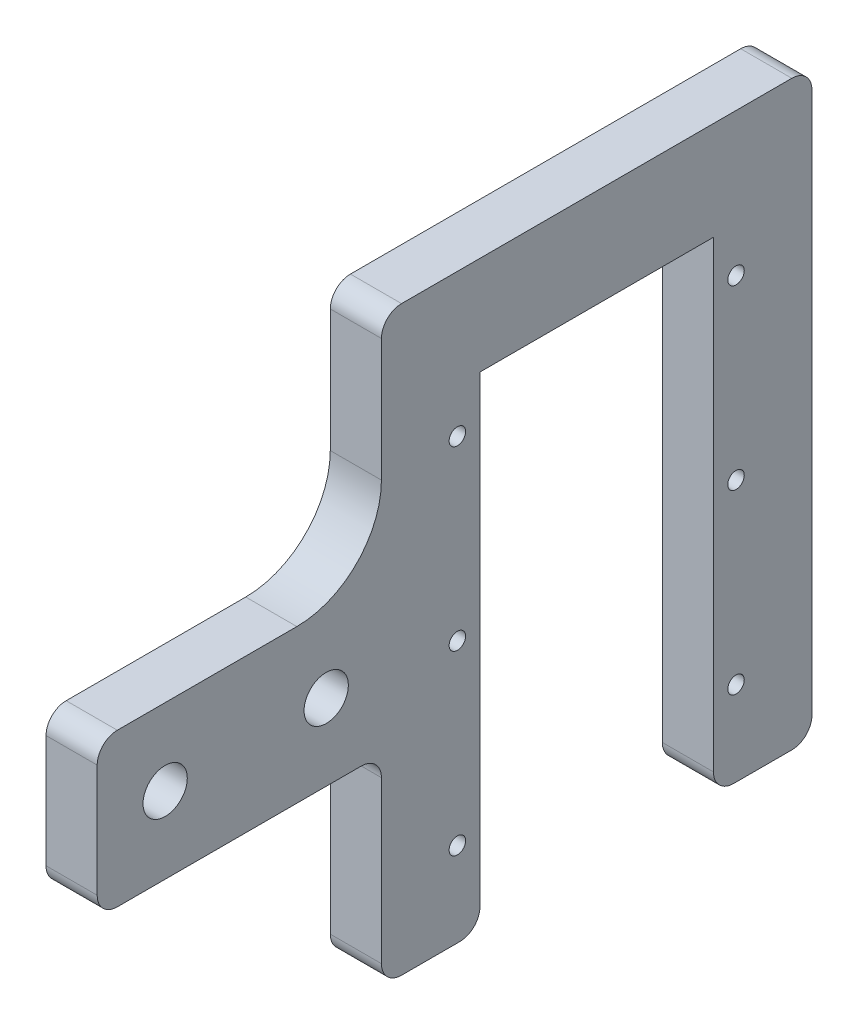
ISO-10303-21;
HEADER;
FILE_DESCRIPTION(('STEP AP214'),'2;1');
FILE_NAME('part.step','',(''),(''),'','','');
FILE_SCHEMA(('AUTOMOTIVE_DESIGN { 1 0 10303 214 1 1 1 1 }'));
ENDSEC;
DATA;
#1=APPLICATION_CONTEXT('core data for automotive mechanical design processes');
#2=APPLICATION_PROTOCOL_DEFINITION('international standard','automotive_design',2000,#1);
#3=PRODUCT_CONTEXT('',#1,'mechanical');
#4=PRODUCT('Part','Part','',(#3));
#5=PRODUCT_RELATED_PRODUCT_CATEGORY('part','',(#4));
#6=PRODUCT_DEFINITION_FORMATION('','',#4);
#7=PRODUCT_DEFINITION_CONTEXT('part definition',#1,'design');
#8=PRODUCT_DEFINITION('design','',#6,#7);
#9=PRODUCT_DEFINITION_SHAPE('','',#8);
#10=(LENGTH_UNIT() NAMED_UNIT(*) SI_UNIT(.MILLI.,.METRE.));
#11=(NAMED_UNIT(*) PLANE_ANGLE_UNIT() SI_UNIT($,.RADIAN.));
#12=(NAMED_UNIT(*) SI_UNIT($,.STERADIAN.) SOLID_ANGLE_UNIT());
#13=UNCERTAINTY_MEASURE_WITH_UNIT(LENGTH_MEASURE(1.E-05),#10,'distance_accuracy_value','');
#14=(GEOMETRIC_REPRESENTATION_CONTEXT(3) GLOBAL_UNCERTAINTY_ASSIGNED_CONTEXT((#13)) GLOBAL_UNIT_ASSIGNED_CONTEXT((#10,
#11,#12)) REPRESENTATION_CONTEXT('',''));
#15=CARTESIAN_POINT('',(0.,0.,0.));
#16=DIRECTION('',(0.,0.,1.));
#17=DIRECTION('',(1.,0.,0.));
#18=AXIS2_PLACEMENT_3D('',#15,#16,#17);
#19=CARTESIAN_POINT('',(3.175,-25.0000000000001,62.0272498174298));
#20=DIRECTION('',(0.,1.,0.));
#21=DIRECTION('',(0.,0.,1.));
#22=AXIS2_PLACEMENT_3D('',#19,#20,#21);
#23=PLANE('',#22);
#24=DIRECTION('',(0.,0.,-1.));
#25=VECTOR('',#24,1.);
#26=CARTESIAN_POINT('',(-3.175,-25.0000000000001,62.0272498174298));
#27=LINE('',#26,#25);
#28=CARTESIAN_POINT('',(-3.175,-25.0000000000001,59.5272498174298));
#29=VERTEX_POINT('',#28);
#30=CARTESIAN_POINT('',(-3.175,-25.,29.2316212801132));
#31=VERTEX_POINT('',#30);
#32=EDGE_CURVE('E206',#29,#31,#27,.T.);
#33=ORIENTED_EDGE('',*,*,#32,.T.);
#34=DIRECTION('',(-1.,0.,0.));
#35=VECTOR('',#34,1.);
#36=CARTESIAN_POINT('',(3.175,-25.,29.2316212801132));
#37=LINE('',#36,#35);
#38=CARTESIAN_POINT('',(3.175,-25.,29.2316212801132));
#39=VERTEX_POINT('',#38);
#40=EDGE_CURVE('E287',#31,#39,#37,.F.);
#41=ORIENTED_EDGE('',*,*,#40,.T.);
#42=DIRECTION('',(0.,0.,-1.));
#43=VECTOR('',#42,1.);
#44=CARTESIAN_POINT('',(3.175,-25.0000000000001,62.0272498174298));
#45=LINE('',#44,#43);
#46=CARTESIAN_POINT('',(3.175,-25.0000000000001,59.5272498174298));
#47=VERTEX_POINT('',#46);
#48=EDGE_CURVE('E215',#47,#39,#45,.T.);
#49=ORIENTED_EDGE('',*,*,#48,.F.);
#50=DIRECTION('',(-1.,0.,0.));
#51=VECTOR('',#50,1.);
#52=CARTESIAN_POINT('',(3.175,-25.0000000000001,59.5272498174298));
#53=LINE('',#52,#51);
#54=EDGE_CURVE('E284',#47,#29,#53,.T.);
#55=ORIENTED_EDGE('',*,*,#54,.T.);
#56=EDGE_LOOP('',(#33,#41,#49,#55));
#57=FACE_BOUND('',#56,.T.);
#58=ADVANCED_FACE('F33',(#57),#23,.F.);
#59=CARTESIAN_POINT('',(3.175,-6.00000000000009,62.0272498174298));
#60=DIRECTION('',(0.,-1.,0.));
#61=DIRECTION('',(0.,0.,-1.));
#62=AXIS2_PLACEMENT_3D('',#59,#60,#61);
#63=PLANE('',#62);
#64=DIRECTION('',(0.,0.,1.));
#65=VECTOR('',#64,1.);
#66=CARTESIAN_POINT('',(3.175,-6.00000000000009,62.0272498174298));
#67=LINE('',#66,#65);
#68=CARTESIAN_POINT('',(3.175,-6.00000000000009,37.2316212801132));
#69=VERTEX_POINT('',#68);
#70=CARTESIAN_POINT('',(3.175,-6.00000000000009,59.5272498174298));
#71=VERTEX_POINT('',#70);
#72=EDGE_CURVE('E218',#69,#71,#67,.T.);
#73=ORIENTED_EDGE('',*,*,#72,.F.);
#74=DIRECTION('',(1.,0.,0.));
#75=VECTOR('',#74,1.);
#76=CARTESIAN_POINT('',(-3.175,-6.00000000000009,37.2316212801132));
#77=LINE('',#76,#75);
#78=CARTESIAN_POINT('',(-3.175,-6.00000000000009,37.2316212801132));
#79=VERTEX_POINT('',#78);
#80=EDGE_CURVE('E54',#69,#79,#77,.F.);
#81=ORIENTED_EDGE('',*,*,#80,.T.);
#82=DIRECTION('',(0.,0.,1.));
#83=VECTOR('',#82,1.);
#84=CARTESIAN_POINT('',(-3.175,-6.00000000000009,62.0272498174298));
#85=LINE('',#84,#83);
#86=CARTESIAN_POINT('',(-3.175,-6.00000000000009,59.5272498174298));
#87=VERTEX_POINT('',#86);
#88=EDGE_CURVE('E210',#79,#87,#85,.T.);
#89=ORIENTED_EDGE('',*,*,#88,.T.);
#90=DIRECTION('',(-1.,0.,0.));
#91=VECTOR('',#90,1.);
#92=CARTESIAN_POINT('',(3.175,-6.00000000000009,59.5272498174298));
#93=LINE('',#92,#91);
#94=EDGE_CURVE('E294',#87,#71,#93,.F.);
#95=ORIENTED_EDGE('',*,*,#94,.T.);
#96=EDGE_LOOP('',(#73,#81,#89,#95));
#97=FACE_BOUND('',#96,.T.);
#98=ADVANCED_FACE('F460',(#97),#63,.F.);
#99=CARTESIAN_POINT('',(3.175,-25.0000000000001,62.0272498174298));
#100=DIRECTION('',(0.,0.,-1.));
#101=DIRECTION('',(0.,1.,0.));
#102=AXIS2_PLACEMENT_3D('',#99,#100,#101);
#103=PLANE('',#102);
#104=DIRECTION('',(0.,-1.,0.));
#105=VECTOR('',#104,1.);
#106=CARTESIAN_POINT('',(-3.175,-25.0000000000001,62.0272498174298));
#107=LINE('',#106,#105);
#108=CARTESIAN_POINT('',(-3.175,-8.50000000000009,62.0272498174298));
#109=VERTEX_POINT('',#108);
#110=CARTESIAN_POINT('',(-3.175,-22.5000000000001,62.0272498174298));
#111=VERTEX_POINT('',#110);
#112=EDGE_CURVE('E219',#109,#111,#107,.T.);
#113=ORIENTED_EDGE('',*,*,#112,.T.);
#114=DIRECTION('',(-1.,0.,0.));
#115=VECTOR('',#114,1.);
#116=CARTESIAN_POINT('',(3.175,-22.5000000000001,62.0272498174298));
#117=LINE('',#116,#115);
#118=CARTESIAN_POINT('',(3.175,-22.5000000000001,62.0272498174298));
#119=VERTEX_POINT('',#118);
#120=EDGE_CURVE('E292',#111,#119,#117,.F.);
#121=ORIENTED_EDGE('',*,*,#120,.T.);
#122=DIRECTION('',(0.,-1.,0.));
#123=VECTOR('',#122,1.);
#124=CARTESIAN_POINT('',(3.175,-25.0000000000001,62.0272498174298));
#125=LINE('',#124,#123);
#126=CARTESIAN_POINT('',(3.175,-8.50000000000009,62.0272498174298));
#127=VERTEX_POINT('',#126);
#128=EDGE_CURVE('E221',#127,#119,#125,.T.);
#129=ORIENTED_EDGE('',*,*,#128,.F.);
#130=DIRECTION('',(-1.,0.,0.));
#131=VECTOR('',#130,1.);
#132=CARTESIAN_POINT('',(3.175,-8.50000000000009,62.0272498174298));
#133=LINE('',#132,#131);
#134=EDGE_CURVE('E289',#127,#109,#133,.T.);
#135=ORIENTED_EDGE('',*,*,#134,.T.);
#136=EDGE_LOOP('',(#113,#121,#129,#135));
#137=FACE_BOUND('',#136,.T.);
#138=ADVANCED_FACE('F425',(#137),#103,.F.);
#139=CARTESIAN_POINT('',(3.175,0.,0.));
#140=DIRECTION('',(1.,0.,0.));
#141=DIRECTION('',(0.,0.,-1.));
#142=AXIS2_PLACEMENT_3D('',#139,#140,#141);
#143=PLANE('',#142);
#144=CARTESIAN_POINT('',(3.175,-15.5000000000001,53.5872498174298));
#145=DIRECTION('',(1.,0.,0.));
#146=DIRECTION('',(0.,0.,-1.));
#147=AXIS2_PLACEMENT_3D('',#144,#145,#146);
#148=CIRCLE('',#147,2.75);
#149=CARTESIAN_POINT('',(3.175,-15.5000000000001,50.8372498174298));
#150=VERTEX_POINT('',#149);
#151=EDGE_CURVE('E417',#150,#150,#148,.T.);
#152=ORIENTED_EDGE('',*,*,#151,.F.);
#153=EDGE_LOOP('',(#152));
#154=FACE_BOUND('',#153,.T.);
#155=CARTESIAN_POINT('',(3.175,-15.5000000000001,33.5872498174298));
#156=DIRECTION('',(1.,0.,0.));
#157=DIRECTION('',(0.,0.,-1.));
#158=AXIS2_PLACEMENT_3D('',#155,#156,#157);
#159=CIRCLE('',#158,2.75);
#160=CARTESIAN_POINT('',(3.175,-15.5000000000001,30.8372498174298));
#161=VERTEX_POINT('',#160);
#162=EDGE_CURVE('E411',#161,#161,#159,.T.);
#163=ORIENTED_EDGE('',*,*,#162,.F.);
#164=EDGE_LOOP('',(#163));
#165=FACE_BOUND('',#164,.T.);
#166=CARTESIAN_POINT('',(3.175,4.49999999999998,-17.3));
#167=DIRECTION('',(1.,0.,0.));
#168=DIRECTION('',(0.,0.,-1.));
#169=AXIS2_PLACEMENT_3D('',#166,#167,#168);
#170=CIRCLE('',#169,1.02499999999994);
#171=CARTESIAN_POINT('',(3.175,4.49999999999998,-18.3249999999999));
#172=VERTEX_POINT('',#171);
#173=EDGE_CURVE('E403',#172,#172,#170,.T.);
#174=ORIENTED_EDGE('',*,*,#173,.F.);
#175=EDGE_LOOP('',(#174));
#176=FACE_BOUND('',#175,.T.);
#177=CARTESIAN_POINT('',(3.175,-17.5,-17.3));
#178=DIRECTION('',(1.,0.,0.));
#179=DIRECTION('',(0.,0.,-1.));
#180=AXIS2_PLACEMENT_3D('',#177,#178,#179);
#181=CIRCLE('',#180,1.02499999999994);
#182=CARTESIAN_POINT('',(3.175,-17.5,-18.3249999999999));
#183=VERTEX_POINT('',#182);
#184=EDGE_CURVE('E397',#183,#183,#181,.T.);
#185=ORIENTED_EDGE('',*,*,#184,.F.);
#186=EDGE_LOOP('',(#185));
#187=FACE_BOUND('',#186,.T.);
#188=CARTESIAN_POINT('',(3.175,-39.5,-17.3));
#189=DIRECTION('',(1.,0.,0.));
#190=DIRECTION('',(0.,0.,-1.));
#191=AXIS2_PLACEMENT_3D('',#188,#189,#190);
#192=CIRCLE('',#191,1.02499999999994);
#193=CARTESIAN_POINT('',(3.175,-39.5,-18.3249999999999));
#194=VERTEX_POINT('',#193);
#195=EDGE_CURVE('E391',#194,#194,#192,.T.);
#196=ORIENTED_EDGE('',*,*,#195,.F.);
#197=EDGE_LOOP('',(#196));
#198=FACE_BOUND('',#197,.T.);
#199=CARTESIAN_POINT('',(3.175,4.49999999999998,17.3));
#200=DIRECTION('',(-1.,0.,0.));
#201=DIRECTION('',(0.,0.,1.));
#202=AXIS2_PLACEMENT_3D('',#199,#200,#201);
#203=CIRCLE('',#202,1.02499999999995);
#204=CARTESIAN_POINT('',(3.175,4.49999999999998,18.325));
#205=VERTEX_POINT('',#204);
#206=EDGE_CURVE('E385',#205,#205,#203,.T.);
#207=ORIENTED_EDGE('',*,*,#206,.T.);
#208=EDGE_LOOP('',(#207));
#209=FACE_BOUND('',#208,.T.);
#210=CARTESIAN_POINT('',(3.175,-17.5,17.3));
#211=DIRECTION('',(-1.,0.,0.));
#212=DIRECTION('',(0.,0.,1.));
#213=AXIS2_PLACEMENT_3D('',#210,#211,#212);
#214=CIRCLE('',#213,1.02499999999995);
#215=CARTESIAN_POINT('',(3.175,-17.5,18.325));
#216=VERTEX_POINT('',#215);
#217=EDGE_CURVE('E379',#216,#216,#214,.T.);
#218=ORIENTED_EDGE('',*,*,#217,.T.);
#219=EDGE_LOOP('',(#218));
#220=FACE_BOUND('',#219,.T.);
#221=CARTESIAN_POINT('',(3.175,-39.5,17.3));
#222=DIRECTION('',(-1.,0.,0.));
#223=DIRECTION('',(0.,0.,1.));
#224=AXIS2_PLACEMENT_3D('',#221,#222,#223);
#225=CIRCLE('',#224,1.02499999999995);
#226=CARTESIAN_POINT('',(3.175,-39.5,18.325));
#227=VERTEX_POINT('',#226);
#228=EDGE_CURVE('E338',#227,#227,#225,.T.);
#229=ORIENTED_EDGE('',*,*,#228,.T.);
#230=EDGE_LOOP('',(#229));
#231=FACE_BOUND('',#230,.T.);
#232=DIRECTION('',(0.,0.,-1.));
#233=VECTOR('',#232,1.);
#234=CARTESIAN_POINT('',(3.175,-50.,-14.5));
#235=LINE('',#234,#233);
#236=CARTESIAN_POINT('',(3.175,-50.,-17.));
#237=VERTEX_POINT('',#236);
#238=CARTESIAN_POINT('',(3.175,-50.,-24.2316212801132));
#239=VERTEX_POINT('',#238);
#240=EDGE_CURVE('E190',#237,#239,#235,.T.);
#241=ORIENTED_EDGE('',*,*,#240,.T.);
#242=CARTESIAN_POINT('',(3.175,-47.5,-24.2316212801132));
#243=DIRECTION('',(1.,0.,0.));
#244=DIRECTION('',(0.,0.,-1.));
#245=AXIS2_PLACEMENT_3D('',#242,#243,#244);
#246=CIRCLE('',#245,2.5);
#247=CARTESIAN_POINT('',(3.175,-47.5,-26.7316212801132));
#248=VERTEX_POINT('',#247);
#249=EDGE_CURVE('E268',#239,#248,#246,.T.);
#250=ORIENTED_EDGE('',*,*,#249,.T.);
#251=DIRECTION('',(0.,1.,0.));
#252=VECTOR('',#251,1.);
#253=CARTESIAN_POINT('',(3.175,-50.,-26.7316212801132));
#254=LINE('',#253,#252);
#255=CARTESIAN_POINT('',(3.175,19.7316212801132,-26.7316212801132));
#256=VERTEX_POINT('',#255);
#257=EDGE_CURVE('E369',#248,#256,#254,.T.);
#258=ORIENTED_EDGE('',*,*,#257,.T.);
#259=CARTESIAN_POINT('',(3.175,19.7316212801132,-24.2316212801132));
#260=DIRECTION('',(1.,0.,0.));
#261=DIRECTION('',(0.,0.,-1.));
#262=AXIS2_PLACEMENT_3D('',#259,#260,#261);
#263=CIRCLE('',#262,2.5);
#264=CARTESIAN_POINT('',(3.175,22.2316212801132,-24.2316212801132));
#265=VERTEX_POINT('',#264);
#266=EDGE_CURVE('E256',#256,#265,#263,.T.);
#267=ORIENTED_EDGE('',*,*,#266,.T.);
#268=DIRECTION('',(0.,0.,1.));
#269=VECTOR('',#268,1.);
#270=CARTESIAN_POINT('',(3.175,22.2316212801132,-26.7316212801132));
#271=LINE('',#270,#269);
#272=CARTESIAN_POINT('',(3.175,22.2316212801132,24.2316212801132));
#273=VERTEX_POINT('',#272);
#274=EDGE_CURVE('E331',#265,#273,#271,.T.);
#275=ORIENTED_EDGE('',*,*,#274,.T.);
#276=CARTESIAN_POINT('',(3.175,19.7316212801132,24.2316212801132));
#277=DIRECTION('',(1.,0.,0.));
#278=DIRECTION('',(0.,0.,-1.));
#279=AXIS2_PLACEMENT_3D('',#276,#277,#278);
#280=CIRCLE('',#279,2.5);
#281=CARTESIAN_POINT('',(3.175,19.7316212801132,26.7316212801132));
#282=VERTEX_POINT('',#281);
#283=EDGE_CURVE('E254',#273,#282,#280,.T.);
#284=ORIENTED_EDGE('',*,*,#283,.T.);
#285=DIRECTION('',(0.,-1.,0.));
#286=VECTOR('',#285,1.);
#287=CARTESIAN_POINT('',(3.175,22.2316212801132,26.7316212801132));
#288=LINE('',#287,#286);
#289=CARTESIAN_POINT('',(3.175,4.49999999999991,26.7316212801132));
#290=VERTEX_POINT('',#289);
#291=EDGE_CURVE('E317',#282,#290,#288,.T.);
#292=ORIENTED_EDGE('',*,*,#291,.T.);
#293=CARTESIAN_POINT('',(3.175,4.49999999999991,37.2316212801132));
#294=DIRECTION('',(1.,0.,0.));
#295=DIRECTION('',(0.,0.,-1.));
#296=AXIS2_PLACEMENT_3D('',#293,#294,#295);
#297=CIRCLE('',#296,10.5);
#298=EDGE_CURVE('E41',#290,#69,#297,.F.);
#299=ORIENTED_EDGE('',*,*,#298,.T.);
#300=ORIENTED_EDGE('',*,*,#72,.T.);
#301=CARTESIAN_POINT('',(3.175,-8.50000000000009,59.5272498174298));
#302=DIRECTION('',(1.,0.,0.));
#303=DIRECTION('',(0.,0.,-1.));
#304=AXIS2_PLACEMENT_3D('',#301,#302,#303);
#305=CIRCLE('',#304,2.5);
#306=EDGE_CURVE('E258',#71,#127,#305,.T.);
#307=ORIENTED_EDGE('',*,*,#306,.T.);
#308=ORIENTED_EDGE('',*,*,#128,.T.);
#309=CARTESIAN_POINT('',(3.175,-22.5000000000001,59.5272498174298));
#310=DIRECTION('',(1.,0.,0.));
#311=DIRECTION('',(0.,0.,-1.));
#312=AXIS2_PLACEMENT_3D('',#309,#310,#311);
#313=CIRCLE('',#312,2.5);
#314=EDGE_CURVE('E260',#119,#47,#313,.T.);
#315=ORIENTED_EDGE('',*,*,#314,.T.);
#316=ORIENTED_EDGE('',*,*,#48,.T.);
#317=CARTESIAN_POINT('',(3.175,-27.5,29.2316212801132));
#318=DIRECTION('',(1.,0.,0.));
#319=DIRECTION('',(0.,0.,-1.));
#320=AXIS2_PLACEMENT_3D('',#317,#318,#319);
#321=CIRCLE('',#320,2.5);
#322=CARTESIAN_POINT('',(3.175,-27.5,26.7316212801132));
#323=VERTEX_POINT('',#322);
#324=EDGE_CURVE('E307',#39,#323,#321,.F.);
#325=ORIENTED_EDGE('',*,*,#324,.T.);
#326=CARTESIAN_POINT('',(3.175,-47.5,26.7316212801132));
#327=VERTEX_POINT('',#326);
#328=EDGE_CURVE('E326',#323,#327,#288,.T.);
#329=ORIENTED_EDGE('',*,*,#328,.T.);
#330=CARTESIAN_POINT('',(3.175,-47.5,24.2316212801132));
#331=DIRECTION('',(1.,0.,0.));
#332=DIRECTION('',(0.,0.,-1.));
#333=AXIS2_PLACEMENT_3D('',#330,#331,#332);
#334=CIRCLE('',#333,2.5);
#335=CARTESIAN_POINT('',(3.175,-50.,24.2316212801132));
#336=VERTEX_POINT('',#335);
#337=EDGE_CURVE('E262',#327,#336,#334,.T.);
#338=ORIENTED_EDGE('',*,*,#337,.T.);
#339=DIRECTION('',(0.,0.,-1.));
#340=VECTOR('',#339,1.);
#341=CARTESIAN_POINT('',(3.175,-50.,26.7316212801132));
#342=LINE('',#341,#340);
#343=CARTESIAN_POINT('',(3.175,-50.,17.));
#344=VERTEX_POINT('',#343);
#345=EDGE_CURVE('E325',#336,#344,#342,.T.);
#346=ORIENTED_EDGE('',*,*,#345,.T.);
#347=CARTESIAN_POINT('',(3.175,-47.5,17.));
#348=DIRECTION('',(1.,0.,0.));
#349=DIRECTION('',(0.,0.,-1.));
#350=AXIS2_PLACEMENT_3D('',#347,#348,#349);
#351=CIRCLE('',#350,2.5);
#352=CARTESIAN_POINT('',(3.175,-47.5,14.5));
#353=VERTEX_POINT('',#352);
#354=EDGE_CURVE('E264',#344,#353,#351,.T.);
#355=ORIENTED_EDGE('',*,*,#354,.T.);
#356=DIRECTION('',(0.,1.,0.));
#357=VECTOR('',#356,1.);
#358=CARTESIAN_POINT('',(3.175,-50.,14.5));
#359=LINE('',#358,#357);
#360=CARTESIAN_POINT('',(3.175,10.,14.5));
#361=VERTEX_POINT('',#360);
#362=EDGE_CURVE('E197',#353,#361,#359,.T.);
#363=ORIENTED_EDGE('',*,*,#362,.T.);
#364=DIRECTION('',(0.,0.,-1.));
#365=VECTOR('',#364,1.);
#366=CARTESIAN_POINT('',(3.175,10.,14.5));
#367=LINE('',#366,#365);
#368=CARTESIAN_POINT('',(3.175,10.,-14.5));
#369=VERTEX_POINT('',#368);
#370=EDGE_CURVE('E191',#361,#369,#367,.T.);
#371=ORIENTED_EDGE('',*,*,#370,.T.);
#372=DIRECTION('',(0.,-1.,0.));
#373=VECTOR('',#372,1.);
#374=CARTESIAN_POINT('',(3.175,10.,-14.5));
#375=LINE('',#374,#373);
#376=CARTESIAN_POINT('',(3.175,-47.5,-14.5));
#377=VERTEX_POINT('',#376);
#378=EDGE_CURVE('E180',#369,#377,#375,.T.);
#379=ORIENTED_EDGE('',*,*,#378,.T.);
#380=CARTESIAN_POINT('',(3.175,-47.5,-17.));
#381=DIRECTION('',(1.,0.,0.));
#382=DIRECTION('',(0.,0.,-1.));
#383=AXIS2_PLACEMENT_3D('',#380,#381,#382);
#384=CIRCLE('',#383,2.5);
#385=EDGE_CURVE('E266',#377,#237,#384,.T.);
#386=ORIENTED_EDGE('',*,*,#385,.T.);
#387=EDGE_LOOP('',(#241,#250,#258,#267,#275,#284,#292,#299,#300,#307,#308,#315,#316,#325,#329,
#338,#346,#355,#363,#371,#379,#386));
#388=FACE_BOUND('',#387,.T.);
#389=ADVANCED_FACE('F195',(#154,#165,#176,#187,#198,#209,#220,#231,#388),#143,.T.);
#390=CARTESIAN_POINT('',(-3.175,0.,0.));
#391=DIRECTION('',(1.,0.,0.));
#392=DIRECTION('',(0.,0.,-1.));
#393=AXIS2_PLACEMENT_3D('',#390,#391,#392);
#394=PLANE('',#393);
#395=CARTESIAN_POINT('',(-3.175,-15.5000000000001,53.5872498174298));
#396=DIRECTION('',(1.,0.,0.));
#397=DIRECTION('',(0.,0.,-1.));
#398=AXIS2_PLACEMENT_3D('',#395,#396,#397);
#399=CIRCLE('',#398,2.75);
#400=CARTESIAN_POINT('',(-3.175,-15.5000000000001,50.8372498174298));
#401=VERTEX_POINT('',#400);
#402=EDGE_CURVE('E414',#401,#401,#399,.T.);
#403=ORIENTED_EDGE('',*,*,#402,.T.);
#404=EDGE_LOOP('',(#403));
#405=FACE_BOUND('',#404,.T.);
#406=CARTESIAN_POINT('',(-3.175,-15.5000000000001,33.5872498174298));
#407=DIRECTION('',(1.,0.,0.));
#408=DIRECTION('',(0.,0.,-1.));
#409=AXIS2_PLACEMENT_3D('',#406,#407,#408);
#410=CIRCLE('',#409,2.75);
#411=CARTESIAN_POINT('',(-3.175,-15.5000000000001,30.8372498174298));
#412=VERTEX_POINT('',#411);
#413=EDGE_CURVE('E406',#412,#412,#410,.T.);
#414=ORIENTED_EDGE('',*,*,#413,.T.);
#415=EDGE_LOOP('',(#414));
#416=FACE_BOUND('',#415,.T.);
#417=CARTESIAN_POINT('',(-3.175,4.49999999999998,-17.3));
#418=DIRECTION('',(1.,0.,0.));
#419=DIRECTION('',(0.,0.,-1.));
#420=AXIS2_PLACEMENT_3D('',#417,#418,#419);
#421=CIRCLE('',#420,1.02499999999994);
#422=CARTESIAN_POINT('',(-3.175,4.49999999999998,-18.3249999999999));
#423=VERTEX_POINT('',#422);
#424=EDGE_CURVE('E400',#423,#423,#421,.T.);
#425=ORIENTED_EDGE('',*,*,#424,.T.);
#426=EDGE_LOOP('',(#425));
#427=FACE_BOUND('',#426,.T.);
#428=CARTESIAN_POINT('',(-3.175,-17.5,-17.3));
#429=DIRECTION('',(1.,0.,0.));
#430=DIRECTION('',(0.,0.,-1.));
#431=AXIS2_PLACEMENT_3D('',#428,#429,#430);
#432=CIRCLE('',#431,1.02499999999994);
#433=CARTESIAN_POINT('',(-3.175,-17.5,-18.3249999999999));
#434=VERTEX_POINT('',#433);
#435=EDGE_CURVE('E394',#434,#434,#432,.T.);
#436=ORIENTED_EDGE('',*,*,#435,.T.);
#437=EDGE_LOOP('',(#436));
#438=FACE_BOUND('',#437,.T.);
#439=CARTESIAN_POINT('',(-3.175,-39.5,-17.3));
#440=DIRECTION('',(1.,0.,0.));
#441=DIRECTION('',(0.,0.,-1.));
#442=AXIS2_PLACEMENT_3D('',#439,#440,#441);
#443=CIRCLE('',#442,1.02499999999994);
#444=CARTESIAN_POINT('',(-3.175,-39.5,-18.3249999999999));
#445=VERTEX_POINT('',#444);
#446=EDGE_CURVE('E388',#445,#445,#443,.T.);
#447=ORIENTED_EDGE('',*,*,#446,.T.);
#448=EDGE_LOOP('',(#447));
#449=FACE_BOUND('',#448,.T.);
#450=CARTESIAN_POINT('',(-3.175,4.49999999999998,17.3));
#451=DIRECTION('',(-1.,0.,0.));
#452=DIRECTION('',(0.,0.,1.));
#453=AXIS2_PLACEMENT_3D('',#450,#451,#452);
#454=CIRCLE('',#453,1.02499999999995);
#455=CARTESIAN_POINT('',(-3.175,4.49999999999998,18.325));
#456=VERTEX_POINT('',#455);
#457=EDGE_CURVE('E382',#456,#456,#454,.T.);
#458=ORIENTED_EDGE('',*,*,#457,.F.);
#459=EDGE_LOOP('',(#458));
#460=FACE_BOUND('',#459,.T.);
#461=CARTESIAN_POINT('',(-3.175,-17.5,17.3));
#462=DIRECTION('',(-1.,0.,0.));
#463=DIRECTION('',(0.,0.,1.));
#464=AXIS2_PLACEMENT_3D('',#461,#462,#463);
#465=CIRCLE('',#464,1.02499999999995);
#466=CARTESIAN_POINT('',(-3.175,-17.5,18.325));
#467=VERTEX_POINT('',#466);
#468=EDGE_CURVE('E376',#467,#467,#465,.T.);
#469=ORIENTED_EDGE('',*,*,#468,.F.);
#470=EDGE_LOOP('',(#469));
#471=FACE_BOUND('',#470,.T.);
#472=CARTESIAN_POINT('',(-3.175,-39.5,17.3));
#473=DIRECTION('',(-1.,0.,0.));
#474=DIRECTION('',(0.,0.,1.));
#475=AXIS2_PLACEMENT_3D('',#472,#473,#474);
#476=CIRCLE('',#475,1.02499999999995);
#477=CARTESIAN_POINT('',(-3.175,-39.5,18.325));
#478=VERTEX_POINT('',#477);
#479=EDGE_CURVE('E373',#478,#478,#476,.T.);
#480=ORIENTED_EDGE('',*,*,#479,.F.);
#481=EDGE_LOOP('',(#480));
#482=FACE_BOUND('',#481,.T.);
#483=DIRECTION('',(0.,1.,0.));
#484=VECTOR('',#483,1.);
#485=CARTESIAN_POINT('',(-3.175,-50.,-26.7316212801132));
#486=LINE('',#485,#484);
#487=CARTESIAN_POINT('',(-3.175,-47.5,-26.7316212801132));
#488=VERTEX_POINT('',#487);
#489=CARTESIAN_POINT('',(-3.175,19.7316212801132,-26.7316212801132));
#490=VERTEX_POINT('',#489);
#491=EDGE_CURVE('E343',#488,#490,#486,.T.);
#492=ORIENTED_EDGE('',*,*,#491,.F.);
#493=CARTESIAN_POINT('',(-3.175,-47.5,-24.2316212801132));
#494=DIRECTION('',(1.,0.,0.));
#495=DIRECTION('',(0.,0.,-1.));
#496=AXIS2_PLACEMENT_3D('',#493,#494,#495);
#497=CIRCLE('',#496,2.5);
#498=CARTESIAN_POINT('',(-3.175,-50.,-24.2316212801132));
#499=VERTEX_POINT('',#498);
#500=EDGE_CURVE('E247',#488,#499,#497,.F.);
#501=ORIENTED_EDGE('',*,*,#500,.T.);
#502=DIRECTION('',(0.,0.,-1.));
#503=VECTOR('',#502,1.);
#504=CARTESIAN_POINT('',(-3.175,-50.,-14.5));
#505=LINE('',#504,#503);
#506=CARTESIAN_POINT('',(-3.175,-50.,-17.));
#507=VERTEX_POINT('',#506);
#508=EDGE_CURVE('E340',#507,#499,#505,.T.);
#509=ORIENTED_EDGE('',*,*,#508,.F.);
#510=CARTESIAN_POINT('',(-3.175,-47.5,-17.));
#511=DIRECTION('',(1.,0.,0.));
#512=DIRECTION('',(0.,0.,-1.));
#513=AXIS2_PLACEMENT_3D('',#510,#511,#512);
#514=CIRCLE('',#513,2.5);
#515=CARTESIAN_POINT('',(-3.175,-47.5,-14.5));
#516=VERTEX_POINT('',#515);
#517=EDGE_CURVE('E245',#507,#516,#514,.F.);
#518=ORIENTED_EDGE('',*,*,#517,.T.);
#519=DIRECTION('',(0.,-1.,0.));
#520=VECTOR('',#519,1.);
#521=CARTESIAN_POINT('',(-3.175,10.,-14.5));
#522=LINE('',#521,#520);
#523=CARTESIAN_POINT('',(-3.175,10.,-14.5));
#524=VERTEX_POINT('',#523);
#525=EDGE_CURVE('E337',#524,#516,#522,.T.);
#526=ORIENTED_EDGE('',*,*,#525,.F.);
#527=DIRECTION('',(0.,0.,-1.));
#528=VECTOR('',#527,1.);
#529=CARTESIAN_POINT('',(-3.175,10.,14.5));
#530=LINE('',#529,#528);
#531=CARTESIAN_POINT('',(-3.175,10.,14.5));
#532=VERTEX_POINT('',#531);
#533=EDGE_CURVE('E205',#532,#524,#530,.T.);
#534=ORIENTED_EDGE('',*,*,#533,.F.);
#535=DIRECTION('',(0.,1.,0.));
#536=VECTOR('',#535,1.);
#537=CARTESIAN_POINT('',(-3.175,-50.,14.5));
#538=LINE('',#537,#536);
#539=CARTESIAN_POINT('',(-3.175,-47.5,14.5));
#540=VERTEX_POINT('',#539);
#541=EDGE_CURVE('E201',#540,#532,#538,.T.);
#542=ORIENTED_EDGE('',*,*,#541,.F.);
#543=CARTESIAN_POINT('',(-3.175,-47.5,17.));
#544=DIRECTION('',(1.,0.,0.));
#545=DIRECTION('',(0.,0.,-1.));
#546=AXIS2_PLACEMENT_3D('',#543,#544,#545);
#547=CIRCLE('',#546,2.5);
#548=CARTESIAN_POINT('',(-3.175,-50.,17.));
#549=VERTEX_POINT('',#548);
#550=EDGE_CURVE('E243',#540,#549,#547,.F.);
#551=ORIENTED_EDGE('',*,*,#550,.T.);
#552=DIRECTION('',(0.,0.,-1.));
#553=VECTOR('',#552,1.);
#554=CARTESIAN_POINT('',(-3.175,-50.,26.7316212801132));
#555=LINE('',#554,#553);
#556=CARTESIAN_POINT('',(-3.175,-50.,24.2316212801132));
#557=VERTEX_POINT('',#556);
#558=EDGE_CURVE('E351',#557,#549,#555,.T.);
#559=ORIENTED_EDGE('',*,*,#558,.F.);
#560=CARTESIAN_POINT('',(-3.175,-47.5,24.2316212801132));
#561=DIRECTION('',(1.,0.,0.));
#562=DIRECTION('',(0.,0.,-1.));
#563=AXIS2_PLACEMENT_3D('',#560,#561,#562);
#564=CIRCLE('',#563,2.5);
#565=CARTESIAN_POINT('',(-3.175,-47.5,26.7316212801132));
#566=VERTEX_POINT('',#565);
#567=EDGE_CURVE('E241',#557,#566,#564,.F.);
#568=ORIENTED_EDGE('',*,*,#567,.T.);
#569=DIRECTION('',(0.,-1.,0.));
#570=VECTOR('',#569,1.);
#571=CARTESIAN_POINT('',(-3.175,22.2316212801132,26.7316212801132));
#572=LINE('',#571,#570);
#573=CARTESIAN_POINT('',(-3.175,-27.5,26.7316212801132));
#574=VERTEX_POINT('',#573);
#575=EDGE_CURVE('E349',#574,#566,#572,.T.);
#576=ORIENTED_EDGE('',*,*,#575,.F.);
#577=CARTESIAN_POINT('',(-3.175,-27.5,29.2316212801132));
#578=DIRECTION('',(1.,0.,0.));
#579=DIRECTION('',(0.,0.,-1.));
#580=AXIS2_PLACEMENT_3D('',#577,#578,#579);
#581=CIRCLE('',#580,2.5);
#582=EDGE_CURVE('E305',#574,#31,#581,.T.);
#583=ORIENTED_EDGE('',*,*,#582,.T.);
#584=ORIENTED_EDGE('',*,*,#32,.F.);
#585=CARTESIAN_POINT('',(-3.175,-22.5000000000001,59.5272498174298));
#586=DIRECTION('',(1.,0.,0.));
#587=DIRECTION('',(0.,0.,-1.));
#588=AXIS2_PLACEMENT_3D('',#585,#586,#587);
#589=CIRCLE('',#588,2.5);
#590=EDGE_CURVE('E239',#29,#111,#589,.F.);
#591=ORIENTED_EDGE('',*,*,#590,.T.);
#592=ORIENTED_EDGE('',*,*,#112,.F.);
#593=CARTESIAN_POINT('',(-3.175,-8.50000000000009,59.5272498174298));
#594=DIRECTION('',(1.,0.,0.));
#595=DIRECTION('',(0.,0.,-1.));
#596=AXIS2_PLACEMENT_3D('',#593,#594,#595);
#597=CIRCLE('',#596,2.5);
#598=EDGE_CURVE('E236',#109,#87,#597,.F.);
#599=ORIENTED_EDGE('',*,*,#598,.T.);
#600=ORIENTED_EDGE('',*,*,#88,.F.);
#601=CARTESIAN_POINT('',(-3.175,4.49999999999991,37.2316212801132));
#602=DIRECTION('',(1.,0.,0.));
#603=DIRECTION('',(0.,0.,-1.));
#604=AXIS2_PLACEMENT_3D('',#601,#602,#603);
#605=CIRCLE('',#604,10.5);
#606=CARTESIAN_POINT('',(-3.175,4.49999999999991,26.7316212801132));
#607=VERTEX_POINT('',#606);
#608=EDGE_CURVE('E11',#79,#607,#605,.T.);
#609=ORIENTED_EDGE('',*,*,#608,.T.);
#610=CARTESIAN_POINT('',(-3.175,19.7316212801132,26.7316212801132));
#611=VERTEX_POINT('',#610);
#612=EDGE_CURVE('E320',#611,#607,#572,.T.);
#613=ORIENTED_EDGE('',*,*,#612,.F.);
#614=CARTESIAN_POINT('',(-3.175,19.7316212801132,24.2316212801132));
#615=DIRECTION('',(1.,0.,0.));
#616=DIRECTION('',(0.,0.,-1.));
#617=AXIS2_PLACEMENT_3D('',#614,#615,#616);
#618=CIRCLE('',#617,2.5);
#619=CARTESIAN_POINT('',(-3.175,22.2316212801132,24.2316212801132));
#620=VERTEX_POINT('',#619);
#621=EDGE_CURVE('E232',#611,#620,#618,.F.);
#622=ORIENTED_EDGE('',*,*,#621,.T.);
#623=DIRECTION('',(0.,0.,1.));
#624=VECTOR('',#623,1.);
#625=CARTESIAN_POINT('',(-3.175,22.2316212801132,-26.7316212801132));
#626=LINE('',#625,#624);
#627=CARTESIAN_POINT('',(-3.175,22.2316212801132,-24.2316212801132));
#628=VERTEX_POINT('',#627);
#629=EDGE_CURVE('E346',#628,#620,#626,.T.);
#630=ORIENTED_EDGE('',*,*,#629,.F.);
#631=CARTESIAN_POINT('',(-3.175,19.7316212801132,-24.2316212801132));
#632=DIRECTION('',(1.,0.,0.));
#633=DIRECTION('',(0.,0.,-1.));
#634=AXIS2_PLACEMENT_3D('',#631,#632,#633);
#635=CIRCLE('',#634,2.5);
#636=EDGE_CURVE('E234',#628,#490,#635,.F.);
#637=ORIENTED_EDGE('',*,*,#636,.T.);
#638=EDGE_LOOP('',(#492,#501,#509,#518,#526,#534,#542,#551,#559,#568,#576,#583,#584,#591,#592,
#599,#600,#609,#613,#622,#630,#637));
#639=FACE_BOUND('',#638,.T.);
#640=ADVANCED_FACE('F359',(#405,#416,#427,#438,#449,#460,#471,#482,#639),#394,.F.);
#641=CARTESIAN_POINT('',(3.175,22.2316212801132,26.7316212801132));
#642=DIRECTION('',(0.,0.,-1.));
#643=DIRECTION('',(0.,1.,0.));
#644=AXIS2_PLACEMENT_3D('',#641,#642,#643);
#645=PLANE('',#644);
#646=ORIENTED_EDGE('',*,*,#575,.T.);
#647=DIRECTION('',(-1.,0.,0.));
#648=VECTOR('',#647,1.);
#649=CARTESIAN_POINT('',(3.175,-47.5,26.7316212801132));
#650=LINE('',#649,#648);
#651=EDGE_CURVE('E282',#566,#327,#650,.F.);
#652=ORIENTED_EDGE('',*,*,#651,.T.);
#653=ORIENTED_EDGE('',*,*,#328,.F.);
#654=DIRECTION('',(-1.,0.,0.));
#655=VECTOR('',#654,1.);
#656=CARTESIAN_POINT('',(-3.175,-27.5,26.7316212801132));
#657=LINE('',#656,#655);
#658=EDGE_CURVE('E279',#323,#574,#657,.T.);
#659=ORIENTED_EDGE('',*,*,#658,.T.);
#660=EDGE_LOOP('',(#646,#652,#653,#659));
#661=FACE_BOUND('',#660,.T.);
#662=ADVANCED_FACE('F449',(#661),#645,.F.);
#663=ORIENTED_EDGE('',*,*,#612,.T.);
#664=DIRECTION('',(1.,0.,0.));
#665=VECTOR('',#664,1.);
#666=CARTESIAN_POINT('',(3.175,4.49999999999991,26.7316212801132));
#667=LINE('',#666,#665);
#668=EDGE_CURVE('E309',#607,#290,#667,.T.);
#669=ORIENTED_EDGE('',*,*,#668,.T.);
#670=ORIENTED_EDGE('',*,*,#291,.F.);
#671=DIRECTION('',(-1.,0.,0.));
#672=VECTOR('',#671,1.);
#673=CARTESIAN_POINT('',(3.175,19.7316212801132,26.7316212801132));
#674=LINE('',#673,#672);
#675=EDGE_CURVE('E302',#282,#611,#674,.T.);
#676=ORIENTED_EDGE('',*,*,#675,.T.);
#677=EDGE_LOOP('',(#663,#669,#670,#676));
#678=FACE_BOUND('',#677,.T.);
#679=ADVANCED_FACE('F316',(#678),#645,.F.);
#680=CARTESIAN_POINT('',(3.175,10.,14.5));
#681=DIRECTION('',(0.,1.,0.));
#682=DIRECTION('',(0.,0.,1.));
#683=AXIS2_PLACEMENT_3D('',#680,#681,#682);
#684=PLANE('',#683);
#685=ORIENTED_EDGE('',*,*,#533,.T.);
#686=DIRECTION('',(-1.,0.,0.));
#687=VECTOR('',#686,1.);
#688=CARTESIAN_POINT('',(3.175,10.,-14.5));
#689=LINE('',#688,#687);
#690=EDGE_CURVE('E185',#369,#524,#689,.T.);
#691=ORIENTED_EDGE('',*,*,#690,.F.);
#692=ORIENTED_EDGE('',*,*,#370,.F.);
#693=DIRECTION('',(-1.,0.,0.));
#694=VECTOR('',#693,1.);
#695=CARTESIAN_POINT('',(3.175,10.,14.5));
#696=LINE('',#695,#694);
#697=EDGE_CURVE('E207',#361,#532,#696,.T.);
#698=ORIENTED_EDGE('',*,*,#697,.T.);
#699=EDGE_LOOP('',(#685,#691,#692,#698));
#700=FACE_BOUND('',#699,.T.);
#701=ADVANCED_FACE('F203',(#700),#684,.F.);
#702=CARTESIAN_POINT('',(3.175,10.,-14.5));
#703=DIRECTION('',(0.,0.,-1.));
#704=DIRECTION('',(0.,1.,0.));
#705=AXIS2_PLACEMENT_3D('',#702,#703,#704);
#706=PLANE('',#705);
#707=ORIENTED_EDGE('',*,*,#525,.T.);
#708=DIRECTION('',(-1.,0.,0.));
#709=VECTOR('',#708,1.);
#710=CARTESIAN_POINT('',(3.175,-47.5,-14.5));
#711=LINE('',#710,#709);
#712=EDGE_CURVE('E188',#516,#377,#711,.F.);
#713=ORIENTED_EDGE('',*,*,#712,.T.);
#714=ORIENTED_EDGE('',*,*,#378,.F.);
#715=ORIENTED_EDGE('',*,*,#690,.T.);
#716=EDGE_LOOP('',(#707,#713,#714,#715));
#717=FACE_BOUND('',#716,.T.);
#718=ADVANCED_FACE('F183',(#717),#706,.F.);
#719=CARTESIAN_POINT('',(3.175,-50.,-14.5));
#720=DIRECTION('',(0.,1.,0.));
#721=DIRECTION('',(0.,0.,1.));
#722=AXIS2_PLACEMENT_3D('',#719,#720,#721);
#723=PLANE('',#722);
#724=ORIENTED_EDGE('',*,*,#508,.T.);
#725=DIRECTION('',(-1.,0.,0.));
#726=VECTOR('',#725,1.);
#727=CARTESIAN_POINT('',(3.175,-50.,-24.2316212801132));
#728=LINE('',#727,#726);
#729=EDGE_CURVE('E252',#499,#239,#728,.F.);
#730=ORIENTED_EDGE('',*,*,#729,.T.);
#731=ORIENTED_EDGE('',*,*,#240,.F.);
#732=DIRECTION('',(-1.,0.,0.));
#733=VECTOR('',#732,1.);
#734=CARTESIAN_POINT('',(3.175,-50.,-17.));
#735=LINE('',#734,#733);
#736=EDGE_CURVE('E249',#237,#507,#735,.T.);
#737=ORIENTED_EDGE('',*,*,#736,.T.);
#738=EDGE_LOOP('',(#724,#730,#731,#737));
#739=FACE_BOUND('',#738,.T.);
#740=ADVANCED_FACE('F367',(#739),#723,.F.);
#741=CARTESIAN_POINT('',(3.175,-50.,-26.7316212801132));
#742=DIRECTION('',(0.,0.,1.));
#743=DIRECTION('',(1.,0.,0.));
#744=AXIS2_PLACEMENT_3D('',#741,#742,#743);
#745=PLANE('',#744);
#746=ORIENTED_EDGE('',*,*,#257,.F.);
#747=DIRECTION('',(-1.,0.,0.));
#748=VECTOR('',#747,1.);
#749=CARTESIAN_POINT('',(3.175,-47.5,-26.7316212801132));
#750=LINE('',#749,#748);
#751=EDGE_CURVE('E229',#248,#488,#750,.T.);
#752=ORIENTED_EDGE('',*,*,#751,.T.);
#753=ORIENTED_EDGE('',*,*,#491,.T.);
#754=DIRECTION('',(-1.,0.,0.));
#755=VECTOR('',#754,1.);
#756=CARTESIAN_POINT('',(3.175,19.7316212801132,-26.7316212801132));
#757=LINE('',#756,#755);
#758=EDGE_CURVE('E223',#490,#256,#757,.F.);
#759=ORIENTED_EDGE('',*,*,#758,.T.);
#760=EDGE_LOOP('',(#746,#752,#753,#759));
#761=FACE_BOUND('',#760,.T.);
#762=ADVANCED_FACE('F539',(#761),#745,.F.);
#763=CARTESIAN_POINT('',(3.175,22.2316212801132,-26.7316212801132));
#764=DIRECTION('',(0.,-1.,0.));
#765=DIRECTION('',(0.,0.,-1.));
#766=AXIS2_PLACEMENT_3D('',#763,#764,#765);
#767=PLANE('',#766);
#768=ORIENTED_EDGE('',*,*,#274,.F.);
#769=DIRECTION('',(-1.,0.,0.));
#770=VECTOR('',#769,1.);
#771=CARTESIAN_POINT('',(3.175,22.2316212801132,-24.2316212801132));
#772=LINE('',#771,#770);
#773=EDGE_CURVE('E299',#265,#628,#772,.T.);
#774=ORIENTED_EDGE('',*,*,#773,.T.);
#775=ORIENTED_EDGE('',*,*,#629,.T.);
#776=DIRECTION('',(-1.,0.,0.));
#777=VECTOR('',#776,1.);
#778=CARTESIAN_POINT('',(3.175,22.2316212801132,24.2316212801132));
#779=LINE('',#778,#777);
#780=EDGE_CURVE('E297',#620,#273,#779,.F.);
#781=ORIENTED_EDGE('',*,*,#780,.T.);
#782=EDGE_LOOP('',(#768,#774,#775,#781));
#783=FACE_BOUND('',#782,.T.);
#784=ADVANCED_FACE('F532',(#783),#767,.F.);
#785=CARTESIAN_POINT('',(3.175,-50.,26.7316212801132));
#786=DIRECTION('',(0.,1.,0.));
#787=DIRECTION('',(0.,0.,1.));
#788=AXIS2_PLACEMENT_3D('',#785,#786,#787);
#789=PLANE('',#788);
#790=ORIENTED_EDGE('',*,*,#558,.T.);
#791=DIRECTION('',(-1.,0.,0.));
#792=VECTOR('',#791,1.);
#793=CARTESIAN_POINT('',(3.175,-50.,17.));
#794=LINE('',#793,#792);
#795=EDGE_CURVE('E277',#549,#344,#794,.F.);
#796=ORIENTED_EDGE('',*,*,#795,.T.);
#797=ORIENTED_EDGE('',*,*,#345,.F.);
#798=DIRECTION('',(-1.,0.,0.));
#799=VECTOR('',#798,1.);
#800=CARTESIAN_POINT('',(3.175,-50.,24.2316212801132));
#801=LINE('',#800,#799);
#802=EDGE_CURVE('E274',#336,#557,#801,.T.);
#803=ORIENTED_EDGE('',*,*,#802,.T.);
#804=EDGE_LOOP('',(#790,#796,#797,#803));
#805=FACE_BOUND('',#804,.T.);
#806=ADVANCED_FACE('F528',(#805),#789,.F.);
#807=CARTESIAN_POINT('',(3.175,-50.,14.5));
#808=DIRECTION('',(0.,0.,1.));
#809=DIRECTION('',(1.,0.,0.));
#810=AXIS2_PLACEMENT_3D('',#807,#808,#809);
#811=PLANE('',#810);
#812=ORIENTED_EDGE('',*,*,#362,.F.);
#813=DIRECTION('',(-1.,0.,0.));
#814=VECTOR('',#813,1.);
#815=CARTESIAN_POINT('',(3.175,-47.5,14.5));
#816=LINE('',#815,#814);
#817=EDGE_CURVE('E271',#353,#540,#816,.T.);
#818=ORIENTED_EDGE('',*,*,#817,.T.);
#819=ORIENTED_EDGE('',*,*,#541,.T.);
#820=ORIENTED_EDGE('',*,*,#697,.F.);
#821=EDGE_LOOP('',(#812,#818,#819,#820));
#822=FACE_BOUND('',#821,.T.);
#823=ADVANCED_FACE('F355',(#822),#811,.F.);
#824=CARTESIAN_POINT('',(3.175,-39.5,17.3));
#825=DIRECTION('',(-1.,0.,0.));
#826=DIRECTION('',(0.,0.,1.));
#827=AXIS2_PLACEMENT_3D('',#824,#825,#826);
#828=CYLINDRICAL_SURFACE('',#827,1.02499999999995);
#829=ORIENTED_EDGE('',*,*,#228,.F.);
#830=EDGE_LOOP('',(#829));
#831=FACE_BOUND('',#830,.T.);
#832=ORIENTED_EDGE('',*,*,#479,.T.);
#833=EDGE_LOOP('',(#832));
#834=FACE_BOUND('',#833,.T.);
#835=ADVANCED_FACE('F441',(#831,#834),#828,.F.);
#836=CARTESIAN_POINT('',(3.175,-17.5,17.3));
#837=DIRECTION('',(-1.,0.,0.));
#838=DIRECTION('',(0.,0.,1.));
#839=AXIS2_PLACEMENT_3D('',#836,#837,#838);
#840=CYLINDRICAL_SURFACE('',#839,1.02499999999995);
#841=ORIENTED_EDGE('',*,*,#217,.F.);
#842=EDGE_LOOP('',(#841));
#843=FACE_BOUND('',#842,.T.);
#844=ORIENTED_EDGE('',*,*,#468,.T.);
#845=EDGE_LOOP('',(#844));
#846=FACE_BOUND('',#845,.T.);
#847=ADVANCED_FACE('F444',(#843,#846),#840,.F.);
#848=CARTESIAN_POINT('',(3.175,4.49999999999998,17.3));
#849=DIRECTION('',(-1.,0.,0.));
#850=DIRECTION('',(0.,0.,1.));
#851=AXIS2_PLACEMENT_3D('',#848,#849,#850);
#852=CYLINDRICAL_SURFACE('',#851,1.02499999999995);
#853=ORIENTED_EDGE('',*,*,#206,.F.);
#854=EDGE_LOOP('',(#853));
#855=FACE_BOUND('',#854,.T.);
#856=ORIENTED_EDGE('',*,*,#457,.T.);
#857=EDGE_LOOP('',(#856));
#858=FACE_BOUND('',#857,.T.);
#859=ADVANCED_FACE('F732',(#855,#858),#852,.F.);
#860=CARTESIAN_POINT('',(3.175,-39.5,-17.3));
#861=DIRECTION('',(-1.,0.,0.));
#862=DIRECTION('',(0.,0.,1.));
#863=AXIS2_PLACEMENT_3D('',#860,#861,#862);
#864=CYLINDRICAL_SURFACE('',#863,1.02499999999994);
#865=ORIENTED_EDGE('',*,*,#195,.T.);
#866=EDGE_LOOP('',(#865));
#867=FACE_BOUND('',#866,.T.);
#868=ORIENTED_EDGE('',*,*,#446,.F.);
#869=EDGE_LOOP('',(#868));
#870=FACE_BOUND('',#869,.T.);
#871=ADVANCED_FACE('F722',(#867,#870),#864,.F.);
#872=CARTESIAN_POINT('',(3.175,-17.5,-17.3));
#873=DIRECTION('',(-1.,0.,0.));
#874=DIRECTION('',(0.,0.,1.));
#875=AXIS2_PLACEMENT_3D('',#872,#873,#874);
#876=CYLINDRICAL_SURFACE('',#875,1.02499999999994);
#877=ORIENTED_EDGE('',*,*,#184,.T.);
#878=EDGE_LOOP('',(#877));
#879=FACE_BOUND('',#878,.T.);
#880=ORIENTED_EDGE('',*,*,#435,.F.);
#881=EDGE_LOOP('',(#880));
#882=FACE_BOUND('',#881,.T.);
#883=ADVANCED_FACE('F712',(#879,#882),#876,.F.);
#884=CARTESIAN_POINT('',(3.175,4.49999999999998,-17.3));
#885=DIRECTION('',(-1.,0.,0.));
#886=DIRECTION('',(0.,0.,1.));
#887=AXIS2_PLACEMENT_3D('',#884,#885,#886);
#888=CYLINDRICAL_SURFACE('',#887,1.02499999999994);
#889=ORIENTED_EDGE('',*,*,#173,.T.);
#890=EDGE_LOOP('',(#889));
#891=FACE_BOUND('',#890,.T.);
#892=ORIENTED_EDGE('',*,*,#424,.F.);
#893=EDGE_LOOP('',(#892));
#894=FACE_BOUND('',#893,.T.);
#895=ADVANCED_FACE('F702',(#891,#894),#888,.F.);
#896=CARTESIAN_POINT('',(3.175,-15.5000000000001,33.5872498174298));
#897=DIRECTION('',(1.,0.,0.));
#898=DIRECTION('',(0.,0.,-1.));
#899=AXIS2_PLACEMENT_3D('',#896,#897,#898);
#900=CYLINDRICAL_SURFACE('',#899,2.75);
#901=ORIENTED_EDGE('',*,*,#413,.F.);
#902=EDGE_LOOP('',(#901));
#903=FACE_BOUND('',#902,.T.);
#904=ORIENTED_EDGE('',*,*,#162,.T.);
#905=EDGE_LOOP('',(#904));
#906=FACE_BOUND('',#905,.T.);
#907=ADVANCED_FACE('F692',(#903,#906),#900,.F.);
#908=CARTESIAN_POINT('',(3.175,-15.5000000000001,53.5872498174298));
#909=DIRECTION('',(1.,0.,0.));
#910=DIRECTION('',(0.,0.,-1.));
#911=AXIS2_PLACEMENT_3D('',#908,#909,#910);
#912=CYLINDRICAL_SURFACE('',#911,2.75);
#913=ORIENTED_EDGE('',*,*,#402,.F.);
#914=EDGE_LOOP('',(#913));
#915=FACE_BOUND('',#914,.T.);
#916=ORIENTED_EDGE('',*,*,#151,.T.);
#917=EDGE_LOOP('',(#916));
#918=FACE_BOUND('',#917,.T.);
#919=ADVANCED_FACE('F421',(#915,#918),#912,.F.);
#920=CARTESIAN_POINT('',(3.175,-47.5,-24.2316212801132));
#921=DIRECTION('',(-1.,0.,0.));
#922=DIRECTION('',(0.,0.,1.));
#923=AXIS2_PLACEMENT_3D('',#920,#921,#922);
#924=CYLINDRICAL_SURFACE('',#923,2.5);
#925=ORIENTED_EDGE('',*,*,#249,.F.);
#926=ORIENTED_EDGE('',*,*,#729,.F.);
#927=ORIENTED_EDGE('',*,*,#500,.F.);
#928=ORIENTED_EDGE('',*,*,#751,.F.);
#929=EDGE_LOOP('',(#925,#926,#927,#928));
#930=FACE_BOUND('',#929,.T.);
#931=ADVANCED_FACE('F468',(#930),#924,.T.);
#932=CARTESIAN_POINT('',(3.175,-47.5,-17.));
#933=DIRECTION('',(-1.,0.,0.));
#934=DIRECTION('',(0.,0.,1.));
#935=AXIS2_PLACEMENT_3D('',#932,#933,#934);
#936=CYLINDRICAL_SURFACE('',#935,2.5);
#937=ORIENTED_EDGE('',*,*,#385,.F.);
#938=ORIENTED_EDGE('',*,*,#712,.F.);
#939=ORIENTED_EDGE('',*,*,#517,.F.);
#940=ORIENTED_EDGE('',*,*,#736,.F.);
#941=EDGE_LOOP('',(#937,#938,#939,#940));
#942=FACE_BOUND('',#941,.T.);
#943=ADVANCED_FACE('F362',(#942),#936,.T.);
#944=CARTESIAN_POINT('',(3.175,-47.5,17.));
#945=DIRECTION('',(-1.,0.,0.));
#946=DIRECTION('',(0.,0.,1.));
#947=AXIS2_PLACEMENT_3D('',#944,#945,#946);
#948=CYLINDRICAL_SURFACE('',#947,2.5);
#949=ORIENTED_EDGE('',*,*,#354,.F.);
#950=ORIENTED_EDGE('',*,*,#795,.F.);
#951=ORIENTED_EDGE('',*,*,#550,.F.);
#952=ORIENTED_EDGE('',*,*,#817,.F.);
#953=EDGE_LOOP('',(#949,#950,#951,#952));
#954=FACE_BOUND('',#953,.T.);
#955=ADVANCED_FACE('F474',(#954),#948,.T.);
#956=CARTESIAN_POINT('',(3.175,-47.5,24.2316212801132));
#957=DIRECTION('',(-1.,0.,0.));
#958=DIRECTION('',(0.,0.,1.));
#959=AXIS2_PLACEMENT_3D('',#956,#957,#958);
#960=CYLINDRICAL_SURFACE('',#959,2.5);
#961=ORIENTED_EDGE('',*,*,#337,.F.);
#962=ORIENTED_EDGE('',*,*,#651,.F.);
#963=ORIENTED_EDGE('',*,*,#567,.F.);
#964=ORIENTED_EDGE('',*,*,#802,.F.);
#965=EDGE_LOOP('',(#961,#962,#963,#964));
#966=FACE_BOUND('',#965,.T.);
#967=ADVANCED_FACE('F477',(#966),#960,.T.);
#968=CARTESIAN_POINT('',(3.175,-27.5,29.2316212801132));
#969=DIRECTION('',(1.,0.,0.));
#970=DIRECTION('',(0.,0.,-1.));
#971=AXIS2_PLACEMENT_3D('',#968,#969,#970);
#972=CYLINDRICAL_SURFACE('',#971,2.5);
#973=ORIENTED_EDGE('',*,*,#324,.F.);
#974=ORIENTED_EDGE('',*,*,#40,.F.);
#975=ORIENTED_EDGE('',*,*,#582,.F.);
#976=ORIENTED_EDGE('',*,*,#658,.F.);
#977=EDGE_LOOP('',(#973,#974,#975,#976));
#978=FACE_BOUND('',#977,.T.);
#979=ADVANCED_FACE('F481',(#978),#972,.F.);
#980=CARTESIAN_POINT('',(3.175,-22.5000000000001,59.5272498174298));
#981=DIRECTION('',(-1.,0.,0.));
#982=DIRECTION('',(0.,0.,1.));
#983=AXIS2_PLACEMENT_3D('',#980,#981,#982);
#984=CYLINDRICAL_SURFACE('',#983,2.5);
#985=ORIENTED_EDGE('',*,*,#314,.F.);
#986=ORIENTED_EDGE('',*,*,#120,.F.);
#987=ORIENTED_EDGE('',*,*,#590,.F.);
#988=ORIENTED_EDGE('',*,*,#54,.F.);
#989=EDGE_LOOP('',(#985,#986,#987,#988));
#990=FACE_BOUND('',#989,.T.);
#991=ADVANCED_FACE('F485',(#990),#984,.T.);
#992=CARTESIAN_POINT('',(3.175,-8.50000000000009,59.5272498174298));
#993=DIRECTION('',(-1.,0.,0.));
#994=DIRECTION('',(0.,0.,1.));
#995=AXIS2_PLACEMENT_3D('',#992,#993,#994);
#996=CYLINDRICAL_SURFACE('',#995,2.5);
#997=ORIENTED_EDGE('',*,*,#306,.F.);
#998=ORIENTED_EDGE('',*,*,#94,.F.);
#999=ORIENTED_EDGE('',*,*,#598,.F.);
#1000=ORIENTED_EDGE('',*,*,#134,.F.);
#1001=EDGE_LOOP('',(#997,#998,#999,#1000));
#1002=FACE_BOUND('',#1001,.T.);
#1003=ADVANCED_FACE('F489',(#1002),#996,.T.);
#1004=CARTESIAN_POINT('',(3.175,19.7316212801132,-24.2316212801132));
#1005=DIRECTION('',(-1.,0.,0.));
#1006=DIRECTION('',(0.,0.,1.));
#1007=AXIS2_PLACEMENT_3D('',#1004,#1005,#1006);
#1008=CYLINDRICAL_SURFACE('',#1007,2.5);
#1009=ORIENTED_EDGE('',*,*,#266,.F.);
#1010=ORIENTED_EDGE('',*,*,#758,.F.);
#1011=ORIENTED_EDGE('',*,*,#636,.F.);
#1012=ORIENTED_EDGE('',*,*,#773,.F.);
#1013=EDGE_LOOP('',(#1009,#1010,#1011,#1012));
#1014=FACE_BOUND('',#1013,.T.);
#1015=ADVANCED_FACE('F493',(#1014),#1008,.T.);
#1016=CARTESIAN_POINT('',(3.175,19.7316212801132,24.2316212801132));
#1017=DIRECTION('',(-1.,0.,0.));
#1018=DIRECTION('',(0.,0.,1.));
#1019=AXIS2_PLACEMENT_3D('',#1016,#1017,#1018);
#1020=CYLINDRICAL_SURFACE('',#1019,2.5);
#1021=ORIENTED_EDGE('',*,*,#283,.F.);
#1022=ORIENTED_EDGE('',*,*,#780,.F.);
#1023=ORIENTED_EDGE('',*,*,#621,.F.);
#1024=ORIENTED_EDGE('',*,*,#675,.F.);
#1025=EDGE_LOOP('',(#1021,#1022,#1023,#1024));
#1026=FACE_BOUND('',#1025,.T.);
#1027=ADVANCED_FACE('F496',(#1026),#1020,.T.);
#1028=CARTESIAN_POINT('',(3.175,4.49999999999991,37.2316212801132));
#1029=DIRECTION('',(-1.,0.,0.));
#1030=DIRECTION('',(0.,0.,1.));
#1031=AXIS2_PLACEMENT_3D('',#1028,#1029,#1030);
#1032=CYLINDRICAL_SURFACE('',#1031,10.5);
#1033=ORIENTED_EDGE('',*,*,#608,.F.);
#1034=ORIENTED_EDGE('',*,*,#80,.F.);
#1035=ORIENTED_EDGE('',*,*,#298,.F.);
#1036=ORIENTED_EDGE('',*,*,#668,.F.);
#1037=EDGE_LOOP('',(#1033,#1034,#1035,#1036));
#1038=FACE_BOUND('',#1037,.T.);
#1039=ADVANCED_FACE('F35',(#1038),#1032,.F.);
#1040=CLOSED_SHELL('',(#58,#98,#138,#389,#640,#662,#679,#701,#718,#740,#762,#784,#806,#823,#835,
#847,#859,#871,#883,#895,#907,#919,#931,#943,#955,#967,#979,#991,#1003,#1015,#1027,#1039));
#1041=MANIFOLD_SOLID_BREP('B2',#1040);
#1042=ADVANCED_BREP_SHAPE_REPRESENTATION('',(#18,#1041),#14);
#1043=SHAPE_DEFINITION_REPRESENTATION(#9,#1042);
ENDSEC;
END-ISO-10303-21;
